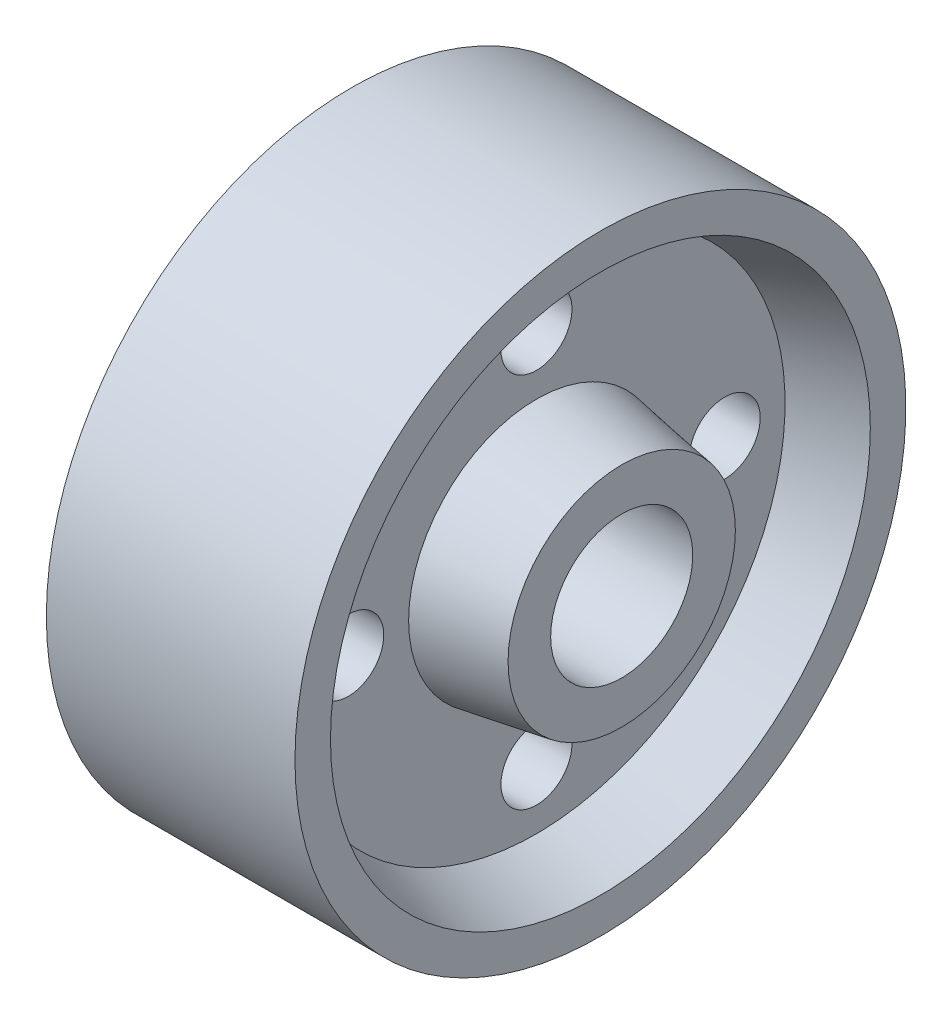
ISO-10303-21;
HEADER;
FILE_DESCRIPTION(('STEP AP214'),'2;1');
FILE_NAME('part.step','',(''),(''),'','','');
FILE_SCHEMA(('AUTOMOTIVE_DESIGN { 1 0 10303 214 1 1 1 1 }'));
ENDSEC;
DATA;
#1=APPLICATION_CONTEXT('core data for automotive mechanical design processes');
#2=APPLICATION_PROTOCOL_DEFINITION('international standard','automotive_design',2000,#1);
#3=PRODUCT_CONTEXT('',#1,'mechanical');
#4=PRODUCT('Part','Part','',(#3));
#5=PRODUCT_RELATED_PRODUCT_CATEGORY('part','',(#4));
#6=PRODUCT_DEFINITION_FORMATION('','',#4);
#7=PRODUCT_DEFINITION_CONTEXT('part definition',#1,'design');
#8=PRODUCT_DEFINITION('design','',#6,#7);
#9=PRODUCT_DEFINITION_SHAPE('','',#8);
#10=(LENGTH_UNIT() NAMED_UNIT(*) SI_UNIT(.MILLI.,.METRE.));
#11=(NAMED_UNIT(*) PLANE_ANGLE_UNIT() SI_UNIT($,.RADIAN.));
#12=(NAMED_UNIT(*) SI_UNIT($,.STERADIAN.) SOLID_ANGLE_UNIT());
#13=UNCERTAINTY_MEASURE_WITH_UNIT(LENGTH_MEASURE(1.E-05),#10,'distance_accuracy_value','');
#14=(GEOMETRIC_REPRESENTATION_CONTEXT(3) GLOBAL_UNCERTAINTY_ASSIGNED_CONTEXT((#13)) GLOBAL_UNIT_ASSIGNED_CONTEXT((#10,
#11,#12)) REPRESENTATION_CONTEXT('',''));
#15=CARTESIAN_POINT('',(0.,0.,0.));
#16=DIRECTION('',(0.,0.,1.));
#17=DIRECTION('',(1.,0.,0.));
#18=AXIS2_PLACEMENT_3D('',#15,#16,#17);
#19=CARTESIAN_POINT('',(1041.4,0.,0.));
#20=DIRECTION('',(-1.,0.,0.));
#21=DIRECTION('',(0.,0.,1.));
#22=AXIS2_PLACEMENT_3D('',#19,#20,#21);
#23=PLANE('',#22);
#24=CARTESIAN_POINT('',(1041.4,0.,0.));
#25=DIRECTION('',(-1.,0.,0.));
#26=DIRECTION('',(0.,0.,1.));
#27=AXIS2_PLACEMENT_3D('',#24,#25,#26);
#28=CIRCLE('',#27,254.);
#29=CARTESIAN_POINT('',(1041.4,0.,254.));
#30=VERTEX_POINT('',#29);
#31=EDGE_CURVE('E66',#30,#30,#28,.T.);
#32=ORIENTED_EDGE('',*,*,#31,.T.);
#33=EDGE_LOOP('',(#32));
#34=FACE_BOUND('',#33,.T.);
#35=CARTESIAN_POINT('',(1041.4,0.,0.));
#36=DIRECTION('',(-1.,0.,0.));
#37=DIRECTION('',(0.,0.,1.));
#38=AXIS2_PLACEMENT_3D('',#35,#36,#37);
#39=CIRCLE('',#38,406.4);
#40=CARTESIAN_POINT('',(1041.4,0.,406.4));
#41=VERTEX_POINT('',#40);
#42=EDGE_CURVE('E10',#41,#41,#39,.T.);
#43=ORIENTED_EDGE('',*,*,#42,.F.);
#44=EDGE_LOOP('',(#43));
#45=FACE_BOUND('',#44,.T.);
#46=ADVANCED_FACE('F43',(#34,#45),#23,.F.);
#47=CARTESIAN_POINT('',(1041.4,0.,0.));
#48=DIRECTION('',(-1.,0.,0.));
#49=DIRECTION('',(0.,0.,1.));
#50=AXIS2_PLACEMENT_3D('',#47,#48,#49);
#51=CONICAL_SURFACE('',#50,406.4,0.165148677414627);
#52=CARTESIAN_POINT('',(736.6,0.,0.));
#53=DIRECTION('',(-1.,0.,0.));
#54=DIRECTION('',(0.,0.,1.));
#55=AXIS2_PLACEMENT_3D('',#52,#53,#54);
#56=CIRCLE('',#55,457.2);
#57=CARTESIAN_POINT('',(736.6,0.,457.2));
#58=VERTEX_POINT('',#57);
#59=EDGE_CURVE('E51',#58,#58,#56,.T.);
#60=ORIENTED_EDGE('',*,*,#59,.F.);
#61=EDGE_LOOP('',(#60));
#62=FACE_BOUND('',#61,.T.);
#63=ORIENTED_EDGE('',*,*,#42,.T.);
#64=EDGE_LOOP('',(#63));
#65=FACE_BOUND('',#64,.T.);
#66=ADVANCED_FACE('F128',(#62,#65),#51,.T.);
#67=CARTESIAN_POINT('',(736.6,0.,-457.2));
#68=DIRECTION('',(-1.,0.,0.));
#69=DIRECTION('',(0.,0.,1.));
#70=AXIS2_PLACEMENT_3D('',#67,#68,#69);
#71=PLANE('',#70);
#72=CARTESIAN_POINT('',(736.6,673.1,0.));
#73=DIRECTION('',(-1.,0.,0.));
#74=DIRECTION('',(0.,0.,1.));
#75=AXIS2_PLACEMENT_3D('',#72,#73,#74);
#76=CIRCLE('',#75,127.);
#77=CARTESIAN_POINT('',(736.6,673.1,127.));
#78=VERTEX_POINT('',#77);
#79=EDGE_CURVE('E88',#78,#78,#76,.T.);
#80=ORIENTED_EDGE('',*,*,#79,.T.);
#81=EDGE_LOOP('',(#80));
#82=FACE_BOUND('',#81,.T.);
#83=CARTESIAN_POINT('',(736.6,-2.35011608917531E-12,673.1));
#84=DIRECTION('',(-1.,0.,0.));
#85=DIRECTION('',(0.,0.,1.));
#86=AXIS2_PLACEMENT_3D('',#83,#84,#85);
#87=CIRCLE('',#86,127.);
#88=CARTESIAN_POINT('',(736.6,-2.35011608917531E-12,800.1));
#89=VERTEX_POINT('',#88);
#90=EDGE_CURVE('E74',#89,#89,#87,.T.);
#91=ORIENTED_EDGE('',*,*,#90,.T.);
#92=EDGE_LOOP('',(#91));
#93=FACE_BOUND('',#92,.T.);
#94=CARTESIAN_POINT('',(736.6,-673.1,-4.70023217835063E-12));
#95=DIRECTION('',(-1.,0.,0.));
#96=DIRECTION('',(0.,0.,1.));
#97=AXIS2_PLACEMENT_3D('',#94,#95,#96);
#98=CIRCLE('',#97,127.);
#99=CARTESIAN_POINT('',(736.6,-673.1,126.999999999995));
#100=VERTEX_POINT('',#99);
#101=EDGE_CURVE('E70',#100,#100,#98,.T.);
#102=ORIENTED_EDGE('',*,*,#101,.T.);
#103=EDGE_LOOP('',(#102));
#104=FACE_BOUND('',#103,.T.);
#105=CARTESIAN_POINT('',(736.6,7.05034826752594E-12,-673.1));
#106=DIRECTION('',(-1.,0.,0.));
#107=DIRECTION('',(0.,0.,1.));
#108=AXIS2_PLACEMENT_3D('',#105,#106,#107);
#109=CIRCLE('',#108,127.);
#110=CARTESIAN_POINT('',(736.6,7.05034826752594E-12,-546.1));
#111=VERTEX_POINT('',#110);
#112=EDGE_CURVE('E65',#111,#111,#109,.T.);
#113=ORIENTED_EDGE('',*,*,#112,.T.);
#114=EDGE_LOOP('',(#113));
#115=FACE_BOUND('',#114,.T.);
#116=CARTESIAN_POINT('',(736.6,0.,0.));
#117=DIRECTION('',(-1.,0.,0.));
#118=DIRECTION('',(0.,0.,1.));
#119=AXIS2_PLACEMENT_3D('',#116,#117,#118);
#120=CIRCLE('',#119,889.);
#121=CARTESIAN_POINT('',(736.6,0.,889.));
#122=VERTEX_POINT('',#121);
#123=EDGE_CURVE('E57',#122,#122,#120,.T.);
#124=ORIENTED_EDGE('',*,*,#123,.F.);
#125=EDGE_LOOP('',(#124));
#126=FACE_BOUND('',#125,.T.);
#127=ORIENTED_EDGE('',*,*,#59,.T.);
#128=EDGE_LOOP('',(#127));
#129=FACE_BOUND('',#128,.T.);
#130=ADVANCED_FACE('F125',(#82,#93,#104,#115,#126,#129),#71,.F.);
#131=CARTESIAN_POINT('',(736.6,0.,0.));
#132=DIRECTION('',(1.,0.,0.));
#133=DIRECTION('',(0.,0.,-1.));
#134=AXIS2_PLACEMENT_3D('',#131,#132,#133);
#135=CONICAL_SURFACE('',#134,889.,0.321750554396642);
#136=CARTESIAN_POINT('',(965.2,0.,0.));
#137=DIRECTION('',(-1.,0.,0.));
#138=DIRECTION('',(0.,0.,1.));
#139=AXIS2_PLACEMENT_3D('',#136,#137,#138);
#140=CIRCLE('',#139,965.2);
#141=CARTESIAN_POINT('',(965.2,0.,965.2));
#142=VERTEX_POINT('',#141);
#143=EDGE_CURVE('E116',#142,#142,#140,.T.);
#144=ORIENTED_EDGE('',*,*,#143,.F.);
#145=EDGE_LOOP('',(#144));
#146=FACE_BOUND('',#145,.T.);
#147=ORIENTED_EDGE('',*,*,#123,.T.);
#148=EDGE_LOOP('',(#147));
#149=FACE_BOUND('',#148,.T.);
#150=ADVANCED_FACE('F123',(#146,#149),#135,.F.);
#151=CARTESIAN_POINT('',(965.2,0.,-965.2));
#152=DIRECTION('',(-1.,0.,0.));
#153=DIRECTION('',(0.,0.,1.));
#154=AXIS2_PLACEMENT_3D('',#151,#152,#153);
#155=PLANE('',#154);
#156=CARTESIAN_POINT('',(965.2,0.,0.));
#157=DIRECTION('',(-1.,0.,0.));
#158=DIRECTION('',(0.,0.,1.));
#159=AXIS2_PLACEMENT_3D('',#156,#157,#158);
#160=CIRCLE('',#159,1092.2);
#161=CARTESIAN_POINT('',(965.2,0.,1092.2));
#162=VERTEX_POINT('',#161);
#163=EDGE_CURVE('E112',#162,#162,#160,.T.);
#164=ORIENTED_EDGE('',*,*,#163,.F.);
#165=EDGE_LOOP('',(#164));
#166=FACE_BOUND('',#165,.T.);
#167=ORIENTED_EDGE('',*,*,#143,.T.);
#168=EDGE_LOOP('',(#167));
#169=FACE_BOUND('',#168,.T.);
#170=ADVANCED_FACE('F141',(#166,#169),#155,.F.);
#171=CARTESIAN_POINT('',(0.,0.,0.));
#172=DIRECTION('',(-1.,0.,0.));
#173=DIRECTION('',(0.,0.,1.));
#174=AXIS2_PLACEMENT_3D('',#171,#172,#173);
#175=CYLINDRICAL_SURFACE('',#174,1092.2);
#176=CARTESIAN_POINT('',(76.1999999999998,0.,0.));
#177=DIRECTION('',(-1.,0.,0.));
#178=DIRECTION('',(0.,0.,1.));
#179=AXIS2_PLACEMENT_3D('',#176,#177,#178);
#180=CIRCLE('',#179,1092.2);
#181=CARTESIAN_POINT('',(76.1999999999998,0.,1092.2));
#182=VERTEX_POINT('',#181);
#183=EDGE_CURVE('E108',#182,#182,#180,.T.);
#184=ORIENTED_EDGE('',*,*,#183,.F.);
#185=EDGE_LOOP('',(#184));
#186=FACE_BOUND('',#185,.T.);
#187=ORIENTED_EDGE('',*,*,#163,.T.);
#188=EDGE_LOOP('',(#187));
#189=FACE_BOUND('',#188,.T.);
#190=ADVANCED_FACE('F145',(#186,#189),#175,.T.);
#191=CARTESIAN_POINT('',(76.1999999999998,0.,-965.2));
#192=DIRECTION('',(1.,0.,0.));
#193=DIRECTION('',(0.,0.,-1.));
#194=AXIS2_PLACEMENT_3D('',#191,#192,#193);
#195=PLANE('',#194);
#196=CARTESIAN_POINT('',(76.1999999999998,0.,0.));
#197=DIRECTION('',(-1.,0.,0.));
#198=DIRECTION('',(0.,0.,1.));
#199=AXIS2_PLACEMENT_3D('',#196,#197,#198);
#200=CIRCLE('',#199,965.2);
#201=CARTESIAN_POINT('',(76.1999999999998,0.,965.2));
#202=VERTEX_POINT('',#201);
#203=EDGE_CURVE('E104',#202,#202,#200,.T.);
#204=ORIENTED_EDGE('',*,*,#203,.F.);
#205=EDGE_LOOP('',(#204));
#206=FACE_BOUND('',#205,.T.);
#207=ORIENTED_EDGE('',*,*,#183,.T.);
#208=EDGE_LOOP('',(#207));
#209=FACE_BOUND('',#208,.T.);
#210=ADVANCED_FACE('F149',(#206,#209),#195,.F.);
#211=CARTESIAN_POINT('',(76.1999999999998,0.,0.));
#212=DIRECTION('',(-1.,0.,0.));
#213=DIRECTION('',(0.,0.,1.));
#214=AXIS2_PLACEMENT_3D('',#211,#212,#213);
#215=CONICAL_SURFACE('',#214,965.2,0.321750554396642);
#216=CARTESIAN_POINT('',(304.8,0.,0.));
#217=DIRECTION('',(-1.,0.,0.));
#218=DIRECTION('',(0.,0.,1.));
#219=AXIS2_PLACEMENT_3D('',#216,#217,#218);
#220=CIRCLE('',#219,889.);
#221=CARTESIAN_POINT('',(304.8,0.,889.));
#222=VERTEX_POINT('',#221);
#223=EDGE_CURVE('E100',#222,#222,#220,.T.);
#224=ORIENTED_EDGE('',*,*,#223,.F.);
#225=EDGE_LOOP('',(#224));
#226=FACE_BOUND('',#225,.T.);
#227=ORIENTED_EDGE('',*,*,#203,.T.);
#228=EDGE_LOOP('',(#227));
#229=FACE_BOUND('',#228,.T.);
#230=ADVANCED_FACE('F153',(#226,#229),#215,.F.);
#231=CARTESIAN_POINT('',(304.8,0.,-457.2));
#232=DIRECTION('',(1.,0.,0.));
#233=DIRECTION('',(0.,0.,-1.));
#234=AXIS2_PLACEMENT_3D('',#231,#232,#233);
#235=PLANE('',#234);
#236=CARTESIAN_POINT('',(304.8,673.1,0.));
#237=DIRECTION('',(1.,0.,0.));
#238=DIRECTION('',(0.,0.,-1.));
#239=AXIS2_PLACEMENT_3D('',#236,#237,#238);
#240=CIRCLE('',#239,127.);
#241=CARTESIAN_POINT('',(304.8,673.1,-127.));
#242=VERTEX_POINT('',#241);
#243=EDGE_CURVE('E46',#242,#242,#240,.T.);
#244=ORIENTED_EDGE('',*,*,#243,.T.);
#245=EDGE_LOOP('',(#244));
#246=FACE_BOUND('',#245,.T.);
#247=CARTESIAN_POINT('',(304.8,-2.35011608917531E-12,673.1));
#248=DIRECTION('',(1.,0.,0.));
#249=DIRECTION('',(0.,0.,-1.));
#250=AXIS2_PLACEMENT_3D('',#247,#248,#249);
#251=CIRCLE('',#250,127.);
#252=CARTESIAN_POINT('',(304.8,-2.35011608917531E-12,546.1));
#253=VERTEX_POINT('',#252);
#254=EDGE_CURVE('E71',#253,#253,#251,.T.);
#255=ORIENTED_EDGE('',*,*,#254,.T.);
#256=EDGE_LOOP('',(#255));
#257=FACE_BOUND('',#256,.T.);
#258=CARTESIAN_POINT('',(304.8,-673.1,-4.70023217835063E-12));
#259=DIRECTION('',(1.,0.,0.));
#260=DIRECTION('',(0.,0.,-1.));
#261=AXIS2_PLACEMENT_3D('',#258,#259,#260);
#262=CIRCLE('',#261,127.);
#263=CARTESIAN_POINT('',(304.8,-673.1,-127.000000000005));
#264=VERTEX_POINT('',#263);
#265=EDGE_CURVE('E67',#264,#264,#262,.T.);
#266=ORIENTED_EDGE('',*,*,#265,.T.);
#267=EDGE_LOOP('',(#266));
#268=FACE_BOUND('',#267,.T.);
#269=CARTESIAN_POINT('',(304.8,7.05034826752594E-12,-673.1));
#270=DIRECTION('',(1.,0.,0.));
#271=DIRECTION('',(0.,0.,-1.));
#272=AXIS2_PLACEMENT_3D('',#269,#270,#271);
#273=CIRCLE('',#272,127.);
#274=CARTESIAN_POINT('',(304.8,7.05034826752594E-12,-800.1));
#275=VERTEX_POINT('',#274);
#276=EDGE_CURVE('E61',#275,#275,#273,.T.);
#277=ORIENTED_EDGE('',*,*,#276,.T.);
#278=EDGE_LOOP('',(#277));
#279=FACE_BOUND('',#278,.T.);
#280=CARTESIAN_POINT('',(304.8,0.,0.));
#281=DIRECTION('',(-1.,0.,0.));
#282=DIRECTION('',(0.,0.,1.));
#283=AXIS2_PLACEMENT_3D('',#280,#281,#282);
#284=CIRCLE('',#283,457.2);
#285=CARTESIAN_POINT('',(304.8,0.,457.2));
#286=VERTEX_POINT('',#285);
#287=EDGE_CURVE('E96',#286,#286,#284,.T.);
#288=ORIENTED_EDGE('',*,*,#287,.F.);
#289=EDGE_LOOP('',(#288));
#290=FACE_BOUND('',#289,.T.);
#291=ORIENTED_EDGE('',*,*,#223,.T.);
#292=EDGE_LOOP('',(#291));
#293=FACE_BOUND('',#292,.T.);
#294=ADVANCED_FACE('F157',(#246,#257,#268,#279,#290,#293),#235,.F.);
#295=CARTESIAN_POINT('',(304.8,0.,0.));
#296=DIRECTION('',(1.,0.,0.));
#297=DIRECTION('',(0.,0.,-1.));
#298=AXIS2_PLACEMENT_3D('',#295,#296,#297);
#299=CONICAL_SURFACE('',#298,457.2,0.165148677414627);
#300=CARTESIAN_POINT('',(0.,0.,0.));
#301=DIRECTION('',(-1.,0.,0.));
#302=DIRECTION('',(0.,0.,1.));
#303=AXIS2_PLACEMENT_3D('',#300,#301,#302);
#304=CIRCLE('',#303,406.4);
#305=CARTESIAN_POINT('',(0.,0.,406.4));
#306=VERTEX_POINT('',#305);
#307=EDGE_CURVE('E92',#306,#306,#304,.T.);
#308=ORIENTED_EDGE('',*,*,#307,.F.);
#309=EDGE_LOOP('',(#308));
#310=FACE_BOUND('',#309,.T.);
#311=ORIENTED_EDGE('',*,*,#287,.T.);
#312=EDGE_LOOP('',(#311));
#313=FACE_BOUND('',#312,.T.);
#314=ADVANCED_FACE('F161',(#310,#313),#299,.T.);
#315=CARTESIAN_POINT('',(0.,0.,0.));
#316=DIRECTION('',(1.,0.,0.));
#317=DIRECTION('',(0.,0.,-1.));
#318=AXIS2_PLACEMENT_3D('',#315,#316,#317);
#319=PLANE('',#318);
#320=CARTESIAN_POINT('',(0.,0.,0.));
#321=DIRECTION('',(-1.,0.,0.));
#322=DIRECTION('',(0.,0.,1.));
#323=AXIS2_PLACEMENT_3D('',#320,#321,#322);
#324=CIRCLE('',#323,254.);
#325=CARTESIAN_POINT('',(0.,0.,254.));
#326=VERTEX_POINT('',#325);
#327=EDGE_CURVE('E196',#326,#326,#324,.T.);
#328=ORIENTED_EDGE('',*,*,#327,.F.);
#329=EDGE_LOOP('',(#328));
#330=FACE_BOUND('',#329,.T.);
#331=ORIENTED_EDGE('',*,*,#307,.T.);
#332=EDGE_LOOP('',(#331));
#333=FACE_BOUND('',#332,.T.);
#334=ADVANCED_FACE('F165',(#330,#333),#319,.F.);
#335=CARTESIAN_POINT('',(1041.4,7.05034826752594E-12,-673.1));
#336=DIRECTION('',(-1.,0.,0.));
#337=DIRECTION('',(0.,0.,1.));
#338=AXIS2_PLACEMENT_3D('',#335,#336,#337);
#339=CYLINDRICAL_SURFACE('',#338,127.);
#340=ORIENTED_EDGE('',*,*,#276,.F.);
#341=EDGE_LOOP('',(#340));
#342=FACE_BOUND('',#341,.T.);
#343=ORIENTED_EDGE('',*,*,#112,.F.);
#344=EDGE_LOOP('',(#343));
#345=FACE_BOUND('',#344,.T.);
#346=ADVANCED_FACE('F169',(#342,#345),#339,.F.);
#347=CARTESIAN_POINT('',(1041.4,-673.1,-4.70023217835063E-12));
#348=DIRECTION('',(-1.,0.,0.));
#349=DIRECTION('',(0.,0.,1.));
#350=AXIS2_PLACEMENT_3D('',#347,#348,#349);
#351=CYLINDRICAL_SURFACE('',#350,127.);
#352=ORIENTED_EDGE('',*,*,#265,.F.);
#353=EDGE_LOOP('',(#352));
#354=FACE_BOUND('',#353,.T.);
#355=ORIENTED_EDGE('',*,*,#101,.F.);
#356=EDGE_LOOP('',(#355));
#357=FACE_BOUND('',#356,.T.);
#358=ADVANCED_FACE('F173',(#354,#357),#351,.F.);
#359=CARTESIAN_POINT('',(1041.4,-2.35011608917531E-12,673.1));
#360=DIRECTION('',(-1.,0.,0.));
#361=DIRECTION('',(0.,0.,1.));
#362=AXIS2_PLACEMENT_3D('',#359,#360,#361);
#363=CYLINDRICAL_SURFACE('',#362,127.);
#364=ORIENTED_EDGE('',*,*,#254,.F.);
#365=EDGE_LOOP('',(#364));
#366=FACE_BOUND('',#365,.T.);
#367=ORIENTED_EDGE('',*,*,#90,.F.);
#368=EDGE_LOOP('',(#367));
#369=FACE_BOUND('',#368,.T.);
#370=ADVANCED_FACE('F177',(#366,#369),#363,.F.);
#371=CARTESIAN_POINT('',(1041.4,673.1,0.));
#372=DIRECTION('',(-1.,0.,0.));
#373=DIRECTION('',(0.,0.,1.));
#374=AXIS2_PLACEMENT_3D('',#371,#372,#373);
#375=CYLINDRICAL_SURFACE('',#374,127.);
#376=ORIENTED_EDGE('',*,*,#243,.F.);
#377=EDGE_LOOP('',(#376));
#378=FACE_BOUND('',#377,.T.);
#379=ORIENTED_EDGE('',*,*,#79,.F.);
#380=EDGE_LOOP('',(#379));
#381=FACE_BOUND('',#380,.T.);
#382=ADVANCED_FACE('F181',(#378,#381),#375,.F.);
#383=CARTESIAN_POINT('',(1041.4,0.,0.));
#384=DIRECTION('',(-1.,0.,0.));
#385=DIRECTION('',(0.,0.,1.));
#386=AXIS2_PLACEMENT_3D('',#383,#384,#385);
#387=CYLINDRICAL_SURFACE('',#386,254.);
#388=ORIENTED_EDGE('',*,*,#31,.F.);
#389=EDGE_LOOP('',(#388));
#390=FACE_BOUND('',#389,.T.);
#391=ORIENTED_EDGE('',*,*,#327,.T.);
#392=EDGE_LOOP('',(#391));
#393=FACE_BOUND('',#392,.T.);
#394=ADVANCED_FACE('F185',(#390,#393),#387,.F.);
#395=CLOSED_SHELL('',(#46,#66,#130,#150,#170,#190,#210,#230,#294,#314,#334,#346,#358,#370,#382,#394));
#396=MANIFOLD_SOLID_BREP('B2',#395);
#397=ADVANCED_BREP_SHAPE_REPRESENTATION('',(#18,#396),#14);
#398=SHAPE_DEFINITION_REPRESENTATION(#9,#397);
ENDSEC;
END-ISO-10303-21;
